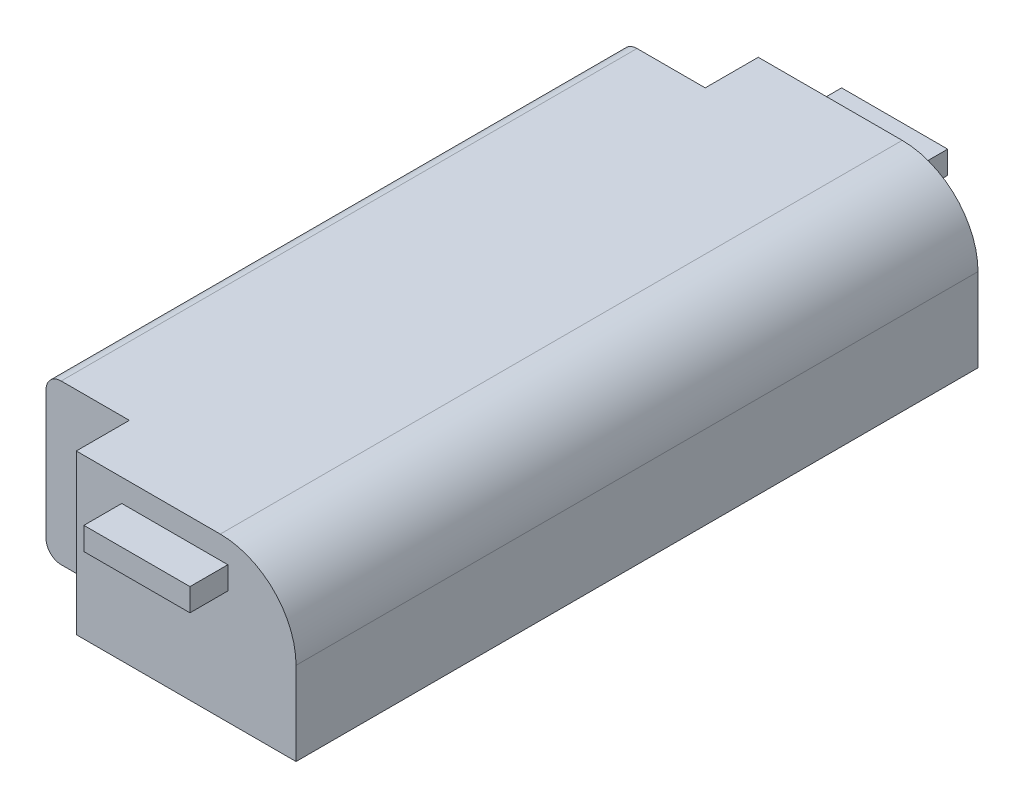
ISO-10303-21;
HEADER;
FILE_DESCRIPTION(('STEP AP214'),'2;1');
FILE_NAME('part.step','',(''),(''),'','','');
FILE_SCHEMA(('AUTOMOTIVE_DESIGN { 1 0 10303 214 1 1 1 1 }'));
ENDSEC;
DATA;
#1=APPLICATION_CONTEXT('core data for automotive mechanical design processes');
#2=APPLICATION_PROTOCOL_DEFINITION('international standard','automotive_design',2000,#1);
#3=PRODUCT_CONTEXT('',#1,'mechanical');
#4=PRODUCT('Part','Part','',(#3));
#5=PRODUCT_RELATED_PRODUCT_CATEGORY('part','',(#4));
#6=PRODUCT_DEFINITION_FORMATION('','',#4);
#7=PRODUCT_DEFINITION_CONTEXT('part definition',#1,'design');
#8=PRODUCT_DEFINITION('design','',#6,#7);
#9=PRODUCT_DEFINITION_SHAPE('','',#8);
#10=(LENGTH_UNIT() NAMED_UNIT(*) SI_UNIT(.MILLI.,.METRE.));
#11=(NAMED_UNIT(*) PLANE_ANGLE_UNIT() SI_UNIT($,.RADIAN.));
#12=(NAMED_UNIT(*) SI_UNIT($,.STERADIAN.) SOLID_ANGLE_UNIT());
#13=UNCERTAINTY_MEASURE_WITH_UNIT(LENGTH_MEASURE(1.E-05),#10,'distance_accuracy_value','');
#14=(GEOMETRIC_REPRESENTATION_CONTEXT(3) GLOBAL_UNCERTAINTY_ASSIGNED_CONTEXT((#13)) GLOBAL_UNIT_ASSIGNED_CONTEXT((#10,
#11,#12)) REPRESENTATION_CONTEXT('',''));
#15=CARTESIAN_POINT('',(0.,0.,0.));
#16=DIRECTION('',(0.,0.,1.));
#17=DIRECTION('',(1.,0.,0.));
#18=AXIS2_PLACEMENT_3D('',#15,#16,#17);
#19=CARTESIAN_POINT('',(0.,0.,-8.88999999999997));
#20=DIRECTION('',(0.,0.,1.));
#21=DIRECTION('',(-1.,0.,0.));
#22=AXIS2_PLACEMENT_3D('',#19,#20,#21);
#23=PLANE('',#22);
#24=DIRECTION('',(-1.,0.,0.));
#25=VECTOR('',#24,1.);
#26=CARTESIAN_POINT('',(6.35,6.35,-8.88999999999997));
#27=LINE('',#26,#25);
#28=CARTESIAN_POINT('',(30.48,6.35,-8.88999999999997));
#29=VERTEX_POINT('',#28);
#30=CARTESIAN_POINT('',(6.35,6.35,-8.88999999999997));
#31=VERTEX_POINT('',#30);
#32=EDGE_CURVE('E249',#29,#31,#27,.T.);
#33=ORIENTED_EDGE('',*,*,#32,.F.);
#34=CARTESIAN_POINT('',(30.48,-6.35,-8.88999999999997));
#35=DIRECTION('',(0.,0.,1.));
#36=DIRECTION('',(1.,0.,0.));
#37=AXIS2_PLACEMENT_3D('',#34,#35,#36);
#38=CIRCLE('',#37,12.7);
#39=CARTESIAN_POINT('',(43.18,-6.35,-8.88999999999997));
#40=VERTEX_POINT('',#39);
#41=EDGE_CURVE('E386',#29,#40,#38,.F.);
#42=ORIENTED_EDGE('',*,*,#41,.T.);
#43=DIRECTION('',(0.,1.,0.));
#44=VECTOR('',#43,1.);
#45=CARTESIAN_POINT('',(43.18,-20.32,-8.88999999999997));
#46=LINE('',#45,#44);
#47=CARTESIAN_POINT('',(43.18,-20.32,-8.88999999999997));
#48=VERTEX_POINT('',#47);
#49=EDGE_CURVE('E252',#48,#40,#46,.T.);
#50=ORIENTED_EDGE('',*,*,#49,.F.);
#51=DIRECTION('',(1.,0.,0.));
#52=VECTOR('',#51,1.);
#53=CARTESIAN_POINT('',(6.35,-20.32,-8.88999999999997));
#54=LINE('',#53,#52);
#55=CARTESIAN_POINT('',(6.35,-20.32,-8.88999999999997));
#56=VERTEX_POINT('',#55);
#57=EDGE_CURVE('E256',#56,#48,#54,.T.);
#58=ORIENTED_EDGE('',*,*,#57,.F.);
#59=DIRECTION('',(0.,-1.,0.));
#60=VECTOR('',#59,1.);
#61=CARTESIAN_POINT('',(6.35,-20.32,-8.88999999999997));
#62=LINE('',#61,#60);
#63=EDGE_CURVE('E245',#31,#56,#62,.T.);
#64=ORIENTED_EDGE('',*,*,#63,.F.);
#65=EDGE_LOOP('',(#33,#42,#50,#58,#64));
#66=FACE_BOUND('',#65,.T.);
#67=DIRECTION('',(0.,-1.,0.));
#68=VECTOR('',#67,1.);
#69=CARTESIAN_POINT('',(31.75,-1.27,-8.88999999999997));
#70=LINE('',#69,#68);
#71=CARTESIAN_POINT('',(31.75,2.54,-8.88999999999997));
#72=VERTEX_POINT('',#71);
#73=CARTESIAN_POINT('',(31.75,-1.27,-8.88999999999997));
#74=VERTEX_POINT('',#73);
#75=EDGE_CURVE('E228',#72,#74,#70,.T.);
#76=ORIENTED_EDGE('',*,*,#75,.F.);
#77=DIRECTION('',(1.,0.,0.));
#78=VECTOR('',#77,1.);
#79=CARTESIAN_POINT('',(31.75,2.54,-8.88999999999997));
#80=LINE('',#79,#78);
#81=CARTESIAN_POINT('',(13.97,2.54,-8.88999999999997));
#82=VERTEX_POINT('',#81);
#83=EDGE_CURVE('E206',#82,#72,#80,.T.);
#84=ORIENTED_EDGE('',*,*,#83,.F.);
#85=DIRECTION('',(0.,1.,0.));
#86=VECTOR('',#85,1.);
#87=CARTESIAN_POINT('',(13.97,-1.27,-8.88999999999997));
#88=LINE('',#87,#86);
#89=CARTESIAN_POINT('',(13.97,-1.27,-8.88999999999997));
#90=VERTEX_POINT('',#89);
#91=EDGE_CURVE('E221',#90,#82,#88,.T.);
#92=ORIENTED_EDGE('',*,*,#91,.F.);
#93=DIRECTION('',(-1.,0.,0.));
#94=VECTOR('',#93,1.);
#95=CARTESIAN_POINT('',(31.75,-1.27,-8.88999999999997));
#96=LINE('',#95,#94);
#97=EDGE_CURVE('E217',#74,#90,#96,.T.);
#98=ORIENTED_EDGE('',*,*,#97,.F.);
#99=EDGE_LOOP('',(#76,#84,#92,#98));
#100=FACE_BOUND('',#99,.T.);
#101=ADVANCED_FACE('F43',(#66,#100),#23,.F.);
#102=CARTESIAN_POINT('',(6.35,0.,96.52));
#103=DIRECTION('',(0.,1.,0.));
#104=DIRECTION('',(-1.,0.,0.));
#105=AXIS2_PLACEMENT_3D('',#102,#103,#104);
#106=PLANE('',#105);
#107=DIRECTION('',(1.,0.,0.));
#108=VECTOR('',#107,1.);
#109=CARTESIAN_POINT('',(6.35,0.,0.));
#110=LINE('',#109,#108);
#111=CARTESIAN_POINT('',(0.,0.,0.));
#112=VERTEX_POINT('',#111);
#113=CARTESIAN_POINT('',(6.35,0.,0.));
#114=VERTEX_POINT('',#113);
#115=EDGE_CURVE('E333',#112,#114,#110,.T.);
#116=ORIENTED_EDGE('',*,*,#115,.T.);
#117=DIRECTION('',(0.,0.,-1.));
#118=VECTOR('',#117,1.);
#119=CARTESIAN_POINT('',(6.35,0.,96.52));
#120=LINE('',#119,#118);
#121=CARTESIAN_POINT('',(6.35,0.,96.52));
#122=VERTEX_POINT('',#121);
#123=EDGE_CURVE('E378',#122,#114,#120,.T.);
#124=ORIENTED_EDGE('',*,*,#123,.F.);
#125=DIRECTION('',(1.,0.,0.));
#126=VECTOR('',#125,1.);
#127=CARTESIAN_POINT('',(6.35,0.,96.52));
#128=LINE('',#127,#126);
#129=CARTESIAN_POINT('',(0.,0.,96.52));
#130=VERTEX_POINT('',#129);
#131=EDGE_CURVE('E334',#130,#122,#128,.T.);
#132=ORIENTED_EDGE('',*,*,#131,.F.);
#133=DIRECTION('',(0.,0.,-1.));
#134=VECTOR('',#133,1.);
#135=CARTESIAN_POINT('',(0.,0.,96.52));
#136=LINE('',#135,#134);
#137=EDGE_CURVE('E350',#130,#112,#136,.T.);
#138=ORIENTED_EDGE('',*,*,#137,.T.);
#139=EDGE_LOOP('',(#116,#124,#132,#138));
#140=FACE_BOUND('',#139,.T.);
#141=ADVANCED_FACE('F445',(#140),#106,.F.);
#142=CARTESIAN_POINT('',(6.35,-20.32,96.52));
#143=DIRECTION('',(1.,0.,0.));
#144=DIRECTION('',(0.,0.,-1.));
#145=AXIS2_PLACEMENT_3D('',#142,#143,#144);
#146=PLANE('',#145);
#147=ORIENTED_EDGE('',*,*,#123,.T.);
#148=DIRECTION('',(0.,-1.,0.));
#149=VECTOR('',#148,1.);
#150=CARTESIAN_POINT('',(6.35,-20.32,0.));
#151=LINE('',#150,#149);
#152=CARTESIAN_POINT('',(6.35,6.35,0.));
#153=VERTEX_POINT('',#152);
#154=EDGE_CURVE('E238',#153,#114,#151,.T.);
#155=ORIENTED_EDGE('',*,*,#154,.F.);
#156=DIRECTION('',(0.,0.,1.));
#157=VECTOR('',#156,1.);
#158=CARTESIAN_POINT('',(6.35,6.35,-8.88999999999997));
#159=LINE('',#158,#157);
#160=EDGE_CURVE('E260',#31,#153,#159,.T.);
#161=ORIENTED_EDGE('',*,*,#160,.F.);
#162=ORIENTED_EDGE('',*,*,#63,.T.);
#163=DIRECTION('',(0.,0.,-1.));
#164=VECTOR('',#163,1.);
#165=CARTESIAN_POINT('',(6.35,-20.32,96.52));
#166=LINE('',#165,#164);
#167=CARTESIAN_POINT('',(6.35,-20.32,105.41));
#168=VERTEX_POINT('',#167);
#169=EDGE_CURVE('E375',#168,#56,#166,.T.);
#170=ORIENTED_EDGE('',*,*,#169,.F.);
#171=DIRECTION('',(0.,-1.,0.));
#172=VECTOR('',#171,1.);
#173=CARTESIAN_POINT('',(6.35,-20.32,105.41));
#174=LINE('',#173,#172);
#175=CARTESIAN_POINT('',(6.35,6.35,105.41));
#176=VERTEX_POINT('',#175);
#177=EDGE_CURVE('E311',#176,#168,#174,.T.);
#178=ORIENTED_EDGE('',*,*,#177,.F.);
#179=DIRECTION('',(0.,0.,-1.));
#180=VECTOR('',#179,1.);
#181=CARTESIAN_POINT('',(6.35,6.35,105.41));
#182=LINE('',#181,#180);
#183=CARTESIAN_POINT('',(6.35,6.35,96.52));
#184=VERTEX_POINT('',#183);
#185=EDGE_CURVE('E326',#176,#184,#182,.T.);
#186=ORIENTED_EDGE('',*,*,#185,.T.);
#187=DIRECTION('',(0.,-1.,0.));
#188=VECTOR('',#187,1.);
#189=CARTESIAN_POINT('',(6.35,-20.32,96.52));
#190=LINE('',#189,#188);
#191=EDGE_CURVE('E301',#184,#122,#190,.T.);
#192=ORIENTED_EDGE('',*,*,#191,.T.);
#193=EDGE_LOOP('',(#147,#155,#161,#162,#170,#178,#186,#192));
#194=FACE_BOUND('',#193,.T.);
#195=ADVANCED_FACE('F441',(#194),#146,.F.);
#196=CARTESIAN_POINT('',(43.18,-20.32,96.52));
#197=DIRECTION('',(0.,1.,0.));
#198=DIRECTION('',(-1.,0.,0.));
#199=AXIS2_PLACEMENT_3D('',#196,#197,#198);
#200=PLANE('',#199);
#201=ORIENTED_EDGE('',*,*,#169,.T.);
#202=ORIENTED_EDGE('',*,*,#57,.T.);
#203=DIRECTION('',(0.,0.,-1.));
#204=VECTOR('',#203,1.);
#205=CARTESIAN_POINT('',(43.18,-20.32,96.52));
#206=LINE('',#205,#204);
#207=CARTESIAN_POINT('',(43.18,-20.32,105.41));
#208=VERTEX_POINT('',#207);
#209=EDGE_CURVE('E372',#208,#48,#206,.T.);
#210=ORIENTED_EDGE('',*,*,#209,.F.);
#211=DIRECTION('',(1.,0.,0.));
#212=VECTOR('',#211,1.);
#213=CARTESIAN_POINT('',(6.35,-20.32,105.41));
#214=LINE('',#213,#212);
#215=EDGE_CURVE('E315',#168,#208,#214,.T.);
#216=ORIENTED_EDGE('',*,*,#215,.F.);
#217=EDGE_LOOP('',(#201,#202,#210,#216));
#218=FACE_BOUND('',#217,.T.);
#219=ADVANCED_FACE('F469',(#218),#200,.F.);
#220=CARTESIAN_POINT('',(43.18,6.35,96.52));
#221=DIRECTION('',(-1.,0.,0.));
#222=DIRECTION('',(0.,0.,1.));
#223=AXIS2_PLACEMENT_3D('',#220,#221,#222);
#224=PLANE('',#223);
#225=ORIENTED_EDGE('',*,*,#49,.T.);
#226=DIRECTION('',(0.,0.,-1.));
#227=VECTOR('',#226,1.);
#228=CARTESIAN_POINT('',(43.18,-6.35,96.52));
#229=LINE('',#228,#227);
#230=CARTESIAN_POINT('',(43.18,-6.35,105.41));
#231=VERTEX_POINT('',#230);
#232=EDGE_CURVE('E389',#40,#231,#229,.F.);
#233=ORIENTED_EDGE('',*,*,#232,.T.);
#234=DIRECTION('',(0.,1.,0.));
#235=VECTOR('',#234,1.);
#236=CARTESIAN_POINT('',(43.18,-20.32,105.41));
#237=LINE('',#236,#235);
#238=EDGE_CURVE('E319',#208,#231,#237,.T.);
#239=ORIENTED_EDGE('',*,*,#238,.F.);
#240=ORIENTED_EDGE('',*,*,#209,.T.);
#241=EDGE_LOOP('',(#225,#233,#239,#240));
#242=FACE_BOUND('',#241,.T.);
#243=ADVANCED_FACE('F467',(#242),#224,.F.);
#244=CARTESIAN_POINT('',(-7.62,6.35,96.52));
#245=DIRECTION('',(0.,-1.,0.));
#246=DIRECTION('',(1.,0.,0.));
#247=AXIS2_PLACEMENT_3D('',#244,#245,#246);
#248=PLANE('',#247);
#249=DIRECTION('',(-1.,0.,0.));
#250=VECTOR('',#249,1.);
#251=CARTESIAN_POINT('',(-7.62,6.35,0.));
#252=LINE('',#251,#250);
#253=CARTESIAN_POINT('',(-5.08,6.35,0.));
#254=VERTEX_POINT('',#253);
#255=EDGE_CURVE('E354',#153,#254,#252,.T.);
#256=ORIENTED_EDGE('',*,*,#255,.T.);
#257=DIRECTION('',(0.,0.,-1.));
#258=VECTOR('',#257,1.);
#259=CARTESIAN_POINT('',(-5.08,6.35,96.52));
#260=LINE('',#259,#258);
#261=CARTESIAN_POINT('',(-5.08,6.35,96.52));
#262=VERTEX_POINT('',#261);
#263=EDGE_CURVE('E11',#254,#262,#260,.F.);
#264=ORIENTED_EDGE('',*,*,#263,.T.);
#265=DIRECTION('',(-1.,0.,0.));
#266=VECTOR('',#265,1.);
#267=CARTESIAN_POINT('',(-7.62,6.35,96.52));
#268=LINE('',#267,#266);
#269=EDGE_CURVE('E337',#184,#262,#268,.T.);
#270=ORIENTED_EDGE('',*,*,#269,.F.);
#271=ORIENTED_EDGE('',*,*,#185,.F.);
#272=DIRECTION('',(-1.,0.,0.));
#273=VECTOR('',#272,1.);
#274=CARTESIAN_POINT('',(6.35,6.35,105.41));
#275=LINE('',#274,#273);
#276=CARTESIAN_POINT('',(30.48,6.35,105.41));
#277=VERTEX_POINT('',#276);
#278=EDGE_CURVE('E323',#277,#176,#275,.T.);
#279=ORIENTED_EDGE('',*,*,#278,.F.);
#280=DIRECTION('',(0.,0.,-1.));
#281=VECTOR('',#280,1.);
#282=CARTESIAN_POINT('',(30.48,6.35,96.52));
#283=LINE('',#282,#281);
#284=EDGE_CURVE('E382',#277,#29,#283,.T.);
#285=ORIENTED_EDGE('',*,*,#284,.T.);
#286=ORIENTED_EDGE('',*,*,#32,.T.);
#287=ORIENTED_EDGE('',*,*,#160,.T.);
#288=EDGE_LOOP('',(#256,#264,#270,#271,#279,#285,#286,#287));
#289=FACE_BOUND('',#288,.T.);
#290=ADVANCED_FACE('F435',(#289),#248,.F.);
#291=CARTESIAN_POINT('',(-7.62,-20.32,96.52));
#292=DIRECTION('',(1.,0.,0.));
#293=DIRECTION('',(0.,1.,0.));
#294=AXIS2_PLACEMENT_3D('',#291,#292,#293);
#295=PLANE('',#294);
#296=DIRECTION('',(0.,-1.,0.));
#297=VECTOR('',#296,1.);
#298=CARTESIAN_POINT('',(-7.62,-20.32,0.));
#299=LINE('',#298,#297);
#300=CARTESIAN_POINT('',(-7.62,3.81,0.));
#301=VERTEX_POINT('',#300);
#302=CARTESIAN_POINT('',(-7.62,-17.78,0.));
#303=VERTEX_POINT('',#302);
#304=EDGE_CURVE('E357',#301,#303,#299,.T.);
#305=ORIENTED_EDGE('',*,*,#304,.T.);
#306=DIRECTION('',(0.,0.,-1.));
#307=VECTOR('',#306,1.);
#308=CARTESIAN_POINT('',(-7.62,-17.78,96.52));
#309=LINE('',#308,#307);
#310=CARTESIAN_POINT('',(-7.62,-17.78,96.52));
#311=VERTEX_POINT('',#310);
#312=EDGE_CURVE('E65',#303,#311,#309,.F.);
#313=ORIENTED_EDGE('',*,*,#312,.T.);
#314=DIRECTION('',(0.,-1.,0.));
#315=VECTOR('',#314,1.);
#316=CARTESIAN_POINT('',(-7.62,-20.32,96.52));
#317=LINE('',#316,#315);
#318=CARTESIAN_POINT('',(-7.62,3.81,96.52));
#319=VERTEX_POINT('',#318);
#320=EDGE_CURVE('E341',#319,#311,#317,.T.);
#321=ORIENTED_EDGE('',*,*,#320,.F.);
#322=DIRECTION('',(0.,0.,-1.));
#323=VECTOR('',#322,1.);
#324=CARTESIAN_POINT('',(-7.62,3.81,96.52));
#325=LINE('',#324,#323);
#326=EDGE_CURVE('E405',#319,#301,#325,.T.);
#327=ORIENTED_EDGE('',*,*,#326,.T.);
#328=EDGE_LOOP('',(#305,#313,#321,#327));
#329=FACE_BOUND('',#328,.T.);
#330=ADVANCED_FACE('F430',(#329),#295,.F.);
#331=CARTESIAN_POINT('',(0.,-20.32,96.52));
#332=DIRECTION('',(0.,1.,0.));
#333=DIRECTION('',(-1.,0.,0.));
#334=AXIS2_PLACEMENT_3D('',#331,#332,#333);
#335=PLANE('',#334);
#336=DIRECTION('',(1.,0.,0.));
#337=VECTOR('',#336,1.);
#338=CARTESIAN_POINT('',(0.,-20.32,96.52));
#339=LINE('',#338,#337);
#340=CARTESIAN_POINT('',(-5.07999999999999,-20.32,96.52));
#341=VERTEX_POINT('',#340);
#342=CARTESIAN_POINT('',(0.,-20.32,96.52));
#343=VERTEX_POINT('',#342);
#344=EDGE_CURVE('E344',#341,#343,#339,.T.);
#345=ORIENTED_EDGE('',*,*,#344,.F.);
#346=DIRECTION('',(0.,0.,-1.));
#347=VECTOR('',#346,1.);
#348=CARTESIAN_POINT('',(-5.08,-20.32,96.52));
#349=LINE('',#348,#347);
#350=CARTESIAN_POINT('',(-5.07999999999999,-20.32,0.));
#351=VERTEX_POINT('',#350);
#352=EDGE_CURVE('E395',#341,#351,#349,.T.);
#353=ORIENTED_EDGE('',*,*,#352,.T.);
#354=DIRECTION('',(1.,0.,0.));
#355=VECTOR('',#354,1.);
#356=CARTESIAN_POINT('',(0.,-20.32,0.));
#357=LINE('',#356,#355);
#358=CARTESIAN_POINT('',(0.,-20.32,0.));
#359=VERTEX_POINT('',#358);
#360=EDGE_CURVE('E360',#351,#359,#357,.T.);
#361=ORIENTED_EDGE('',*,*,#360,.T.);
#362=DIRECTION('',(0.,0.,-1.));
#363=VECTOR('',#362,1.);
#364=CARTESIAN_POINT('',(0.,-20.32,96.52));
#365=LINE('',#364,#363);
#366=EDGE_CURVE('E368',#343,#359,#365,.T.);
#367=ORIENTED_EDGE('',*,*,#366,.F.);
#368=EDGE_LOOP('',(#345,#353,#361,#367));
#369=FACE_BOUND('',#368,.T.);
#370=ADVANCED_FACE('F422',(#369),#335,.F.);
#371=CARTESIAN_POINT('',(0.,0.,96.52));
#372=DIRECTION('',(-1.,0.,0.));
#373=DIRECTION('',(0.,-1.,0.));
#374=AXIS2_PLACEMENT_3D('',#371,#372,#373);
#375=PLANE('',#374);
#376=DIRECTION('',(0.,1.,0.));
#377=VECTOR('',#376,1.);
#378=CARTESIAN_POINT('',(0.,0.,0.));
#379=LINE('',#378,#377);
#380=EDGE_CURVE('E338',#359,#112,#379,.T.);
#381=ORIENTED_EDGE('',*,*,#380,.T.);
#382=ORIENTED_EDGE('',*,*,#137,.F.);
#383=DIRECTION('',(0.,1.,0.));
#384=VECTOR('',#383,1.);
#385=CARTESIAN_POINT('',(0.,0.,96.52));
#386=LINE('',#385,#384);
#387=EDGE_CURVE('E347',#343,#130,#386,.T.);
#388=ORIENTED_EDGE('',*,*,#387,.F.);
#389=ORIENTED_EDGE('',*,*,#366,.T.);
#390=EDGE_LOOP('',(#381,#382,#388,#389));
#391=FACE_BOUND('',#390,.T.);
#392=ADVANCED_FACE('F449',(#391),#375,.F.);
#393=CARTESIAN_POINT('',(0.,0.,96.52));
#394=DIRECTION('',(0.,0.,1.));
#395=DIRECTION('',(1.,0.,0.));
#396=AXIS2_PLACEMENT_3D('',#393,#394,#395);
#397=PLANE('',#396);
#398=ORIENTED_EDGE('',*,*,#320,.T.);
#399=CARTESIAN_POINT('',(-5.08,-17.78,96.52));
#400=DIRECTION('',(0.,0.,1.));
#401=DIRECTION('',(1.,0.,0.));
#402=AXIS2_PLACEMENT_3D('',#399,#400,#401);
#403=CIRCLE('',#402,2.54);
#404=EDGE_CURVE('E52',#311,#341,#403,.T.);
#405=ORIENTED_EDGE('',*,*,#404,.T.);
#406=ORIENTED_EDGE('',*,*,#344,.T.);
#407=ORIENTED_EDGE('',*,*,#387,.T.);
#408=ORIENTED_EDGE('',*,*,#131,.T.);
#409=ORIENTED_EDGE('',*,*,#191,.F.);
#410=ORIENTED_EDGE('',*,*,#269,.T.);
#411=CARTESIAN_POINT('',(-5.08,3.81,96.52));
#412=DIRECTION('',(0.,0.,1.));
#413=DIRECTION('',(1.,0.,0.));
#414=AXIS2_PLACEMENT_3D('',#411,#412,#413);
#415=CIRCLE('',#414,2.54);
#416=EDGE_CURVE('E411',#262,#319,#415,.T.);
#417=ORIENTED_EDGE('',*,*,#416,.T.);
#418=EDGE_LOOP('',(#398,#405,#406,#407,#408,#409,#410,#417));
#419=FACE_BOUND('',#418,.T.);
#420=ADVANCED_FACE('F417',(#419),#397,.T.);
#421=CARTESIAN_POINT('',(0.,0.,0.));
#422=DIRECTION('',(0.,0.,1.));
#423=DIRECTION('',(1.,0.,0.));
#424=AXIS2_PLACEMENT_3D('',#421,#422,#423);
#425=PLANE('',#424);
#426=ORIENTED_EDGE('',*,*,#360,.F.);
#427=CARTESIAN_POINT('',(-5.08,-17.78,0.));
#428=DIRECTION('',(0.,0.,1.));
#429=DIRECTION('',(1.,0.,0.));
#430=AXIS2_PLACEMENT_3D('',#427,#428,#429);
#431=CIRCLE('',#430,2.54);
#432=EDGE_CURVE('E402',#351,#303,#431,.F.);
#433=ORIENTED_EDGE('',*,*,#432,.T.);
#434=ORIENTED_EDGE('',*,*,#304,.F.);
#435=CARTESIAN_POINT('',(-5.08,3.81,0.));
#436=DIRECTION('',(0.,0.,1.));
#437=DIRECTION('',(1.,0.,0.));
#438=AXIS2_PLACEMENT_3D('',#435,#436,#437);
#439=CIRCLE('',#438,2.54);
#440=EDGE_CURVE('E399',#301,#254,#439,.F.);
#441=ORIENTED_EDGE('',*,*,#440,.T.);
#442=ORIENTED_EDGE('',*,*,#255,.F.);
#443=ORIENTED_EDGE('',*,*,#154,.T.);
#444=ORIENTED_EDGE('',*,*,#115,.F.);
#445=ORIENTED_EDGE('',*,*,#380,.F.);
#446=EDGE_LOOP('',(#426,#433,#434,#441,#442,#443,#444,#445));
#447=FACE_BOUND('',#446,.T.);
#448=ADVANCED_FACE('F428',(#447),#425,.F.);
#449=CARTESIAN_POINT('',(0.,0.,105.41));
#450=DIRECTION('',(0.,0.,-1.));
#451=DIRECTION('',(-1.,0.,0.));
#452=AXIS2_PLACEMENT_3D('',#449,#450,#451);
#453=PLANE('',#452);
#454=DIRECTION('',(1.,0.,0.));
#455=VECTOR('',#454,1.);
#456=CARTESIAN_POINT('',(31.75,2.54,105.41));
#457=LINE('',#456,#455);
#458=CARTESIAN_POINT('',(13.97,2.54,105.41));
#459=VERTEX_POINT('',#458);
#460=CARTESIAN_POINT('',(31.75,2.54,105.41));
#461=VERTEX_POINT('',#460);
#462=EDGE_CURVE('E271',#459,#461,#457,.T.);
#463=ORIENTED_EDGE('',*,*,#462,.T.);
#464=DIRECTION('',(0.,-1.,0.));
#465=VECTOR('',#464,1.);
#466=CARTESIAN_POINT('',(31.75,-1.27,105.41));
#467=LINE('',#466,#465);
#468=CARTESIAN_POINT('',(31.75,-1.27,105.41));
#469=VERTEX_POINT('',#468);
#470=EDGE_CURVE('E265',#461,#469,#467,.T.);
#471=ORIENTED_EDGE('',*,*,#470,.T.);
#472=DIRECTION('',(-1.,0.,0.));
#473=VECTOR('',#472,1.);
#474=CARTESIAN_POINT('',(31.75,-1.27,105.41));
#475=LINE('',#474,#473);
#476=CARTESIAN_POINT('',(13.97,-1.27,105.41));
#477=VERTEX_POINT('',#476);
#478=EDGE_CURVE('E287',#469,#477,#475,.T.);
#479=ORIENTED_EDGE('',*,*,#478,.T.);
#480=DIRECTION('',(0.,1.,0.));
#481=VECTOR('',#480,1.);
#482=CARTESIAN_POINT('',(13.97,-1.27,105.41));
#483=LINE('',#482,#481);
#484=EDGE_CURVE('E291',#477,#459,#483,.T.);
#485=ORIENTED_EDGE('',*,*,#484,.T.);
#486=EDGE_LOOP('',(#463,#471,#479,#485));
#487=FACE_BOUND('',#486,.T.);
#488=ORIENTED_EDGE('',*,*,#238,.T.);
#489=CARTESIAN_POINT('',(30.48,-6.35,105.41));
#490=DIRECTION('',(0.,0.,-1.));
#491=DIRECTION('',(-1.,0.,0.));
#492=AXIS2_PLACEMENT_3D('',#489,#490,#491);
#493=CIRCLE('',#492,12.7);
#494=EDGE_CURVE('E392',#231,#277,#493,.F.);
#495=ORIENTED_EDGE('',*,*,#494,.T.);
#496=ORIENTED_EDGE('',*,*,#278,.T.);
#497=ORIENTED_EDGE('',*,*,#177,.T.);
#498=ORIENTED_EDGE('',*,*,#215,.T.);
#499=EDGE_LOOP('',(#488,#495,#496,#497,#498));
#500=FACE_BOUND('',#499,.T.);
#501=ADVANCED_FACE('F455',(#487,#500),#453,.F.);
#502=CARTESIAN_POINT('',(31.75,-1.27,111.76));
#503=DIRECTION('',(1.,0.,0.));
#504=DIRECTION('',(0.,0.,-1.));
#505=AXIS2_PLACEMENT_3D('',#502,#503,#504);
#506=PLANE('',#505);
#507=ORIENTED_EDGE('',*,*,#470,.F.);
#508=DIRECTION('',(0.,0.,-1.));
#509=VECTOR('',#508,1.);
#510=CARTESIAN_POINT('',(31.75,2.54,111.76));
#511=LINE('',#510,#509);
#512=CARTESIAN_POINT('',(31.75,2.54,111.76));
#513=VERTEX_POINT('',#512);
#514=EDGE_CURVE('E298',#513,#461,#511,.T.);
#515=ORIENTED_EDGE('',*,*,#514,.F.);
#516=DIRECTION('',(0.,-1.,0.));
#517=VECTOR('',#516,1.);
#518=CARTESIAN_POINT('',(31.75,-1.27,111.76));
#519=LINE('',#518,#517);
#520=CARTESIAN_POINT('',(31.75,-1.27,111.76));
#521=VERTEX_POINT('',#520);
#522=EDGE_CURVE('E266',#513,#521,#519,.T.);
#523=ORIENTED_EDGE('',*,*,#522,.T.);
#524=DIRECTION('',(0.,0.,-1.));
#525=VECTOR('',#524,1.);
#526=CARTESIAN_POINT('',(31.75,-1.27,111.76));
#527=LINE('',#526,#525);
#528=EDGE_CURVE('E283',#521,#469,#527,.T.);
#529=ORIENTED_EDGE('',*,*,#528,.T.);
#530=EDGE_LOOP('',(#507,#515,#523,#529));
#531=FACE_BOUND('',#530,.T.);
#532=ADVANCED_FACE('F496',(#531),#506,.T.);
#533=CARTESIAN_POINT('',(31.75,2.54,111.76));
#534=DIRECTION('',(0.,1.,0.));
#535=DIRECTION('',(0.,0.,1.));
#536=AXIS2_PLACEMENT_3D('',#533,#534,#535);
#537=PLANE('',#536);
#538=ORIENTED_EDGE('',*,*,#462,.F.);
#539=DIRECTION('',(0.,0.,-1.));
#540=VECTOR('',#539,1.);
#541=CARTESIAN_POINT('',(13.97,2.54,111.76));
#542=LINE('',#541,#540);
#543=CARTESIAN_POINT('',(13.97,2.54,111.76));
#544=VERTEX_POINT('',#543);
#545=EDGE_CURVE('E302',#544,#459,#542,.T.);
#546=ORIENTED_EDGE('',*,*,#545,.F.);
#547=DIRECTION('',(1.,0.,0.));
#548=VECTOR('',#547,1.);
#549=CARTESIAN_POINT('',(31.75,2.54,111.76));
#550=LINE('',#549,#548);
#551=EDGE_CURVE('E279',#544,#513,#550,.T.);
#552=ORIENTED_EDGE('',*,*,#551,.T.);
#553=ORIENTED_EDGE('',*,*,#514,.T.);
#554=EDGE_LOOP('',(#538,#546,#552,#553));
#555=FACE_BOUND('',#554,.T.);
#556=ADVANCED_FACE('F492',(#555),#537,.T.);
#557=CARTESIAN_POINT('',(13.97,-1.27,111.76));
#558=DIRECTION('',(-1.,0.,0.));
#559=DIRECTION('',(0.,0.,1.));
#560=AXIS2_PLACEMENT_3D('',#557,#558,#559);
#561=PLANE('',#560);
#562=ORIENTED_EDGE('',*,*,#484,.F.);
#563=DIRECTION('',(0.,0.,-1.));
#564=VECTOR('',#563,1.);
#565=CARTESIAN_POINT('',(13.97,-1.27,111.76));
#566=LINE('',#565,#564);
#567=CARTESIAN_POINT('',(13.97,-1.27,111.76));
#568=VERTEX_POINT('',#567);
#569=EDGE_CURVE('E305',#568,#477,#566,.T.);
#570=ORIENTED_EDGE('',*,*,#569,.F.);
#571=DIRECTION('',(0.,1.,0.));
#572=VECTOR('',#571,1.);
#573=CARTESIAN_POINT('',(13.97,-1.27,111.76));
#574=LINE('',#573,#572);
#575=EDGE_CURVE('E275',#568,#544,#574,.T.);
#576=ORIENTED_EDGE('',*,*,#575,.T.);
#577=ORIENTED_EDGE('',*,*,#545,.T.);
#578=EDGE_LOOP('',(#562,#570,#576,#577));
#579=FACE_BOUND('',#578,.T.);
#580=ADVANCED_FACE('F495',(#579),#561,.T.);
#581=CARTESIAN_POINT('',(31.75,-1.27,111.76));
#582=DIRECTION('',(0.,-1.,0.));
#583=DIRECTION('',(0.,0.,-1.));
#584=AXIS2_PLACEMENT_3D('',#581,#582,#583);
#585=PLANE('',#584);
#586=ORIENTED_EDGE('',*,*,#478,.F.);
#587=ORIENTED_EDGE('',*,*,#528,.F.);
#588=DIRECTION('',(-1.,0.,0.));
#589=VECTOR('',#588,1.);
#590=CARTESIAN_POINT('',(31.75,-1.27,111.76));
#591=LINE('',#590,#589);
#592=EDGE_CURVE('E270',#521,#568,#591,.T.);
#593=ORIENTED_EDGE('',*,*,#592,.T.);
#594=ORIENTED_EDGE('',*,*,#569,.T.);
#595=EDGE_LOOP('',(#586,#587,#593,#594));
#596=FACE_BOUND('',#595,.T.);
#597=ADVANCED_FACE('F490',(#596),#585,.T.);
#598=CARTESIAN_POINT('',(0.,0.,111.76));
#599=DIRECTION('',(0.,0.,1.));
#600=DIRECTION('',(1.,0.,0.));
#601=AXIS2_PLACEMENT_3D('',#598,#599,#600);
#602=PLANE('',#601);
#603=ORIENTED_EDGE('',*,*,#522,.F.);
#604=ORIENTED_EDGE('',*,*,#551,.F.);
#605=ORIENTED_EDGE('',*,*,#575,.F.);
#606=ORIENTED_EDGE('',*,*,#592,.F.);
#607=EDGE_LOOP('',(#603,#604,#605,#606));
#608=FACE_BOUND('',#607,.T.);
#609=ADVANCED_FACE('F487',(#608),#602,.T.);
#610=CARTESIAN_POINT('',(31.75,-1.27,-15.24));
#611=DIRECTION('',(-1.,0.,0.));
#612=DIRECTION('',(0.,0.,1.));
#613=AXIS2_PLACEMENT_3D('',#610,#611,#612);
#614=PLANE('',#613);
#615=ORIENTED_EDGE('',*,*,#75,.T.);
#616=DIRECTION('',(0.,0.,1.));
#617=VECTOR('',#616,1.);
#618=CARTESIAN_POINT('',(31.75,-1.27,-15.24));
#619=LINE('',#618,#617);
#620=CARTESIAN_POINT('',(31.75,-1.27,-15.24));
#621=VERTEX_POINT('',#620);
#622=EDGE_CURVE('E215',#621,#74,#619,.T.);
#623=ORIENTED_EDGE('',*,*,#622,.F.);
#624=DIRECTION('',(0.,-1.,0.));
#625=VECTOR('',#624,1.);
#626=CARTESIAN_POINT('',(31.75,-1.27,-15.24));
#627=LINE('',#626,#625);
#628=CARTESIAN_POINT('',(31.75,2.54,-15.24));
#629=VERTEX_POINT('',#628);
#630=EDGE_CURVE('E193',#629,#621,#627,.T.);
#631=ORIENTED_EDGE('',*,*,#630,.F.);
#632=DIRECTION('',(0.,0.,1.));
#633=VECTOR('',#632,1.);
#634=CARTESIAN_POINT('',(31.75,2.54,-15.24));
#635=LINE('',#634,#633);
#636=EDGE_CURVE('E204',#629,#72,#635,.T.);
#637=ORIENTED_EDGE('',*,*,#636,.T.);
#638=EDGE_LOOP('',(#615,#623,#631,#637));
#639=FACE_BOUND('',#638,.T.);
#640=ADVANCED_FACE('F213',(#639),#614,.F.);
#641=CARTESIAN_POINT('',(31.75,-1.27,-15.24));
#642=DIRECTION('',(0.,1.,0.));
#643=DIRECTION('',(0.,0.,1.));
#644=AXIS2_PLACEMENT_3D('',#641,#642,#643);
#645=PLANE('',#644);
#646=ORIENTED_EDGE('',*,*,#97,.T.);
#647=DIRECTION('',(0.,0.,1.));
#648=VECTOR('',#647,1.);
#649=CARTESIAN_POINT('',(13.97,-1.27,-15.24));
#650=LINE('',#649,#648);
#651=CARTESIAN_POINT('',(13.97,-1.27,-15.24));
#652=VERTEX_POINT('',#651);
#653=EDGE_CURVE('E239',#652,#90,#650,.T.);
#654=ORIENTED_EDGE('',*,*,#653,.F.);
#655=DIRECTION('',(-1.,0.,0.));
#656=VECTOR('',#655,1.);
#657=CARTESIAN_POINT('',(31.75,-1.27,-15.24));
#658=LINE('',#657,#656);
#659=EDGE_CURVE('E211',#621,#652,#658,.T.);
#660=ORIENTED_EDGE('',*,*,#659,.F.);
#661=ORIENTED_EDGE('',*,*,#622,.T.);
#662=EDGE_LOOP('',(#646,#654,#660,#661));
#663=FACE_BOUND('',#662,.T.);
#664=ADVANCED_FACE('F578',(#663),#645,.F.);
#665=CARTESIAN_POINT('',(13.97,-1.27,-15.24));
#666=DIRECTION('',(1.,0.,0.));
#667=DIRECTION('',(0.,0.,-1.));
#668=AXIS2_PLACEMENT_3D('',#665,#666,#667);
#669=PLANE('',#668);
#670=ORIENTED_EDGE('',*,*,#91,.T.);
#671=DIRECTION('',(0.,0.,1.));
#672=VECTOR('',#671,1.);
#673=CARTESIAN_POINT('',(13.97,2.54,-15.24));
#674=LINE('',#673,#672);
#675=CARTESIAN_POINT('',(13.97,2.54,-15.24));
#676=VERTEX_POINT('',#675);
#677=EDGE_CURVE('E210',#676,#82,#674,.T.);
#678=ORIENTED_EDGE('',*,*,#677,.F.);
#679=DIRECTION('',(0.,1.,0.));
#680=VECTOR('',#679,1.);
#681=CARTESIAN_POINT('',(13.97,-1.27,-15.24));
#682=LINE('',#681,#680);
#683=EDGE_CURVE('E196',#652,#676,#682,.T.);
#684=ORIENTED_EDGE('',*,*,#683,.F.);
#685=ORIENTED_EDGE('',*,*,#653,.T.);
#686=EDGE_LOOP('',(#670,#678,#684,#685));
#687=FACE_BOUND('',#686,.T.);
#688=ADVANCED_FACE('F584',(#687),#669,.F.);
#689=CARTESIAN_POINT('',(31.75,2.54,-15.24));
#690=DIRECTION('',(0.,-1.,0.));
#691=DIRECTION('',(0.,0.,-1.));
#692=AXIS2_PLACEMENT_3D('',#689,#690,#691);
#693=PLANE('',#692);
#694=ORIENTED_EDGE('',*,*,#83,.T.);
#695=ORIENTED_EDGE('',*,*,#636,.F.);
#696=DIRECTION('',(1.,0.,0.));
#697=VECTOR('',#696,1.);
#698=CARTESIAN_POINT('',(31.75,2.54,-15.24));
#699=LINE('',#698,#697);
#700=EDGE_CURVE('E189',#676,#629,#699,.T.);
#701=ORIENTED_EDGE('',*,*,#700,.F.);
#702=ORIENTED_EDGE('',*,*,#677,.T.);
#703=EDGE_LOOP('',(#694,#695,#701,#702));
#704=FACE_BOUND('',#703,.T.);
#705=ADVANCED_FACE('F205',(#704),#693,.F.);
#706=CARTESIAN_POINT('',(0.,0.,-15.24));
#707=DIRECTION('',(0.,0.,-1.));
#708=DIRECTION('',(1.,0.,0.));
#709=AXIS2_PLACEMENT_3D('',#706,#707,#708);
#710=PLANE('',#709);
#711=ORIENTED_EDGE('',*,*,#630,.T.);
#712=ORIENTED_EDGE('',*,*,#659,.T.);
#713=ORIENTED_EDGE('',*,*,#683,.T.);
#714=ORIENTED_EDGE('',*,*,#700,.T.);
#715=EDGE_LOOP('',(#711,#712,#713,#714));
#716=FACE_BOUND('',#715,.T.);
#717=ADVANCED_FACE('F191',(#716),#710,.T.);
#718=CARTESIAN_POINT('',(30.48,-6.35,96.52));
#719=DIRECTION('',(0.,0.,-1.));
#720=DIRECTION('',(-1.,0.,0.));
#721=AXIS2_PLACEMENT_3D('',#718,#719,#720);
#722=CYLINDRICAL_SURFACE('',#721,12.7);
#723=ORIENTED_EDGE('',*,*,#494,.F.);
#724=ORIENTED_EDGE('',*,*,#232,.F.);
#725=ORIENTED_EDGE('',*,*,#41,.F.);
#726=ORIENTED_EDGE('',*,*,#284,.F.);
#727=EDGE_LOOP('',(#723,#724,#725,#726));
#728=FACE_BOUND('',#727,.T.);
#729=ADVANCED_FACE('F460',(#728),#722,.T.);
#730=CARTESIAN_POINT('',(-5.08,-17.78,96.52));
#731=DIRECTION('',(0.,0.,-1.));
#732=DIRECTION('',(-1.,0.,0.));
#733=AXIS2_PLACEMENT_3D('',#730,#731,#732);
#734=CYLINDRICAL_SURFACE('',#733,2.54);
#735=ORIENTED_EDGE('',*,*,#404,.F.);
#736=ORIENTED_EDGE('',*,*,#312,.F.);
#737=ORIENTED_EDGE('',*,*,#432,.F.);
#738=ORIENTED_EDGE('',*,*,#352,.F.);
#739=EDGE_LOOP('',(#735,#736,#737,#738));
#740=FACE_BOUND('',#739,.T.);
#741=ADVANCED_FACE('F425',(#740),#734,.T.);
#742=CARTESIAN_POINT('',(-5.08,3.81,96.52));
#743=DIRECTION('',(0.,0.,-1.));
#744=DIRECTION('',(-1.,0.,0.));
#745=AXIS2_PLACEMENT_3D('',#742,#743,#744);
#746=CYLINDRICAL_SURFACE('',#745,2.54);
#747=ORIENTED_EDGE('',*,*,#416,.F.);
#748=ORIENTED_EDGE('',*,*,#263,.F.);
#749=ORIENTED_EDGE('',*,*,#440,.F.);
#750=ORIENTED_EDGE('',*,*,#326,.F.);
#751=EDGE_LOOP('',(#747,#748,#749,#750));
#752=FACE_BOUND('',#751,.T.);
#753=ADVANCED_FACE('F45',(#752),#746,.T.);
#754=CLOSED_SHELL('',(#101,#141,#195,#219,#243,#290,#330,#370,#392,#420,#448,#501,#532,#556,
#580,#597,#609,#640,#664,#688,#705,#717,#729,#741,#753));
#755=MANIFOLD_SOLID_BREP('B2',#754);
#756=ADVANCED_BREP_SHAPE_REPRESENTATION('',(#18,#755),#14);
#757=SHAPE_DEFINITION_REPRESENTATION(#9,#756);
ENDSEC;
END-ISO-10303-21;
